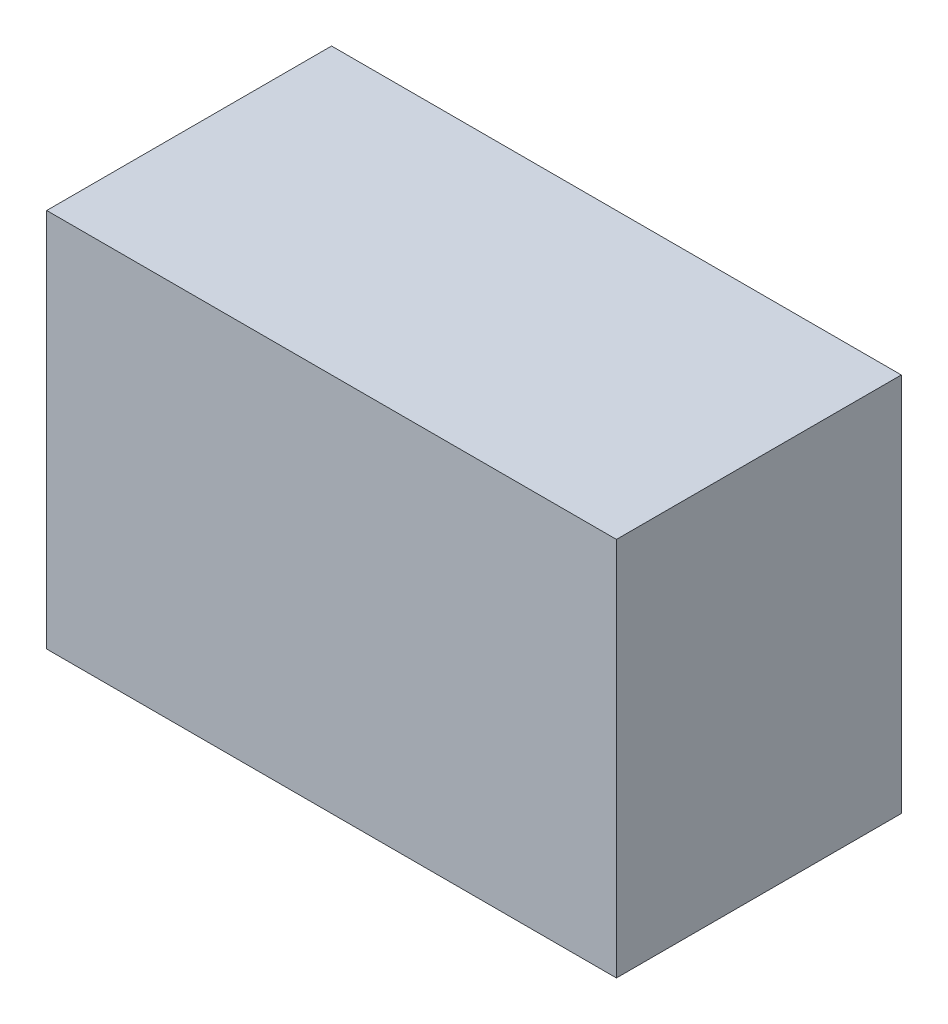
ISO-10303-21;
HEADER;
FILE_DESCRIPTION(('STEP AP214'),'2;1');
FILE_NAME('part.step','',(''),(''),'','','');
FILE_SCHEMA(('AUTOMOTIVE_DESIGN { 1 0 10303 214 1 1 1 1 }'));
ENDSEC;
DATA;
#1=APPLICATION_CONTEXT('core data for automotive mechanical design processes');
#2=APPLICATION_PROTOCOL_DEFINITION('international standard','automotive_design',2000,#1);
#3=PRODUCT_CONTEXT('',#1,'mechanical');
#4=PRODUCT('Part','Part','',(#3));
#5=PRODUCT_RELATED_PRODUCT_CATEGORY('part','',(#4));
#6=PRODUCT_DEFINITION_FORMATION('','',#4);
#7=PRODUCT_DEFINITION_CONTEXT('part definition',#1,'design');
#8=PRODUCT_DEFINITION('design','',#6,#7);
#9=PRODUCT_DEFINITION_SHAPE('','',#8);
#10=(LENGTH_UNIT() NAMED_UNIT(*) SI_UNIT(.MILLI.,.METRE.));
#11=(NAMED_UNIT(*) PLANE_ANGLE_UNIT() SI_UNIT($,.RADIAN.));
#12=(NAMED_UNIT(*) SI_UNIT($,.STERADIAN.) SOLID_ANGLE_UNIT());
#13=UNCERTAINTY_MEASURE_WITH_UNIT(LENGTH_MEASURE(1.E-05),#10,'distance_accuracy_value','');
#14=(GEOMETRIC_REPRESENTATION_CONTEXT(3) GLOBAL_UNCERTAINTY_ASSIGNED_CONTEXT((#13)) GLOBAL_UNIT_ASSIGNED_CONTEXT((#10,
#11,#12)) REPRESENTATION_CONTEXT('',''));
#15=CARTESIAN_POINT('',(0.,0.,0.));
#16=DIRECTION('',(0.,0.,1.));
#17=DIRECTION('',(1.,0.,0.));
#18=AXIS2_PLACEMENT_3D('',#15,#16,#17);
#19=CARTESIAN_POINT('',(0.,0.,6.));
#20=DIRECTION('',(0.,0.,1.));
#21=DIRECTION('',(1.,0.,0.));
#22=AXIS2_PLACEMENT_3D('',#19,#20,#21);
#23=PLANE('',#22);
#24=DIRECTION('',(-1.,0.,0.));
#25=VECTOR('',#24,1.);
#26=CARTESIAN_POINT('',(0.,-8.,6.));
#27=LINE('',#26,#25);
#28=CARTESIAN_POINT('',(12.,-8.,6.));
#29=VERTEX_POINT('',#28);
#30=CARTESIAN_POINT('',(-12.,-8.,6.));
#31=VERTEX_POINT('',#30);
#32=EDGE_CURVE('E10',#29,#31,#27,.T.);
#33=ORIENTED_EDGE('',*,*,#32,.F.);
#34=DIRECTION('',(0.,-1.,0.));
#35=VECTOR('',#34,1.);
#36=CARTESIAN_POINT('',(12.,0.,6.));
#37=LINE('',#36,#35);
#38=CARTESIAN_POINT('',(12.,8.,6.));
#39=VERTEX_POINT('',#38);
#40=EDGE_CURVE('E58',#39,#29,#37,.T.);
#41=ORIENTED_EDGE('',*,*,#40,.F.);
#42=DIRECTION('',(1.,0.,0.));
#43=VECTOR('',#42,1.);
#44=CARTESIAN_POINT('',(0.,8.,6.));
#45=LINE('',#44,#43);
#46=CARTESIAN_POINT('',(-12.,8.,6.));
#47=VERTEX_POINT('',#46);
#48=EDGE_CURVE('E88',#47,#39,#45,.T.);
#49=ORIENTED_EDGE('',*,*,#48,.F.);
#50=DIRECTION('',(0.,1.,0.));
#51=VECTOR('',#50,1.);
#52=CARTESIAN_POINT('',(-12.,0.,6.));
#53=LINE('',#52,#51);
#54=EDGE_CURVE('E23',#31,#47,#53,.T.);
#55=ORIENTED_EDGE('',*,*,#54,.F.);
#56=EDGE_LOOP('',(#33,#41,#49,#55));
#57=FACE_BOUND('',#56,.T.);
#58=ADVANCED_FACE('F16',(#57),#23,.T.);
#59=CARTESIAN_POINT('',(0.,-8.,-6.));
#60=DIRECTION('',(0.,-1.,0.));
#61=DIRECTION('',(0.,0.,-1.));
#62=AXIS2_PLACEMENT_3D('',#59,#60,#61);
#63=PLANE('',#62);
#64=DIRECTION('',(0.,0.,1.));
#65=VECTOR('',#64,1.);
#66=CARTESIAN_POINT('',(12.,-8.,-6.));
#67=LINE('',#66,#65);
#68=CARTESIAN_POINT('',(12.,-8.,-6.));
#69=VERTEX_POINT('',#68);
#70=EDGE_CURVE('E52',#69,#29,#67,.T.);
#71=ORIENTED_EDGE('',*,*,#70,.T.);
#72=ORIENTED_EDGE('',*,*,#32,.T.);
#73=DIRECTION('',(0.,0.,1.));
#74=VECTOR('',#73,1.);
#75=CARTESIAN_POINT('',(-12.,-8.,-6.));
#76=LINE('',#75,#74);
#77=CARTESIAN_POINT('',(-12.,-8.,-6.));
#78=VERTEX_POINT('',#77);
#79=EDGE_CURVE('E66',#78,#31,#76,.T.);
#80=ORIENTED_EDGE('',*,*,#79,.F.);
#81=DIRECTION('',(1.,0.,0.));
#82=VECTOR('',#81,1.);
#83=CARTESIAN_POINT('',(0.,-8.,-6.));
#84=LINE('',#83,#82);
#85=EDGE_CURVE('E63',#78,#69,#84,.T.);
#86=ORIENTED_EDGE('',*,*,#85,.T.);
#87=EDGE_LOOP('',(#71,#72,#80,#86));
#88=FACE_BOUND('',#87,.T.);
#89=ADVANCED_FACE('F65',(#88),#63,.T.);
#90=CARTESIAN_POINT('',(-12.,0.,-6.));
#91=DIRECTION('',(-1.,0.,0.));
#92=DIRECTION('',(0.,0.,1.));
#93=AXIS2_PLACEMENT_3D('',#90,#91,#92);
#94=PLANE('',#93);
#95=ORIENTED_EDGE('',*,*,#79,.T.);
#96=ORIENTED_EDGE('',*,*,#54,.T.);
#97=DIRECTION('',(0.,0.,1.));
#98=VECTOR('',#97,1.);
#99=CARTESIAN_POINT('',(-12.,8.,-6.));
#100=LINE('',#99,#98);
#101=CARTESIAN_POINT('',(-12.,8.,-6.));
#102=VERTEX_POINT('',#101);
#103=EDGE_CURVE('E81',#102,#47,#100,.T.);
#104=ORIENTED_EDGE('',*,*,#103,.F.);
#105=DIRECTION('',(0.,-1.,0.));
#106=VECTOR('',#105,1.);
#107=CARTESIAN_POINT('',(-12.,0.,-6.));
#108=LINE('',#107,#106);
#109=EDGE_CURVE('E69',#102,#78,#108,.T.);
#110=ORIENTED_EDGE('',*,*,#109,.T.);
#111=EDGE_LOOP('',(#95,#96,#104,#110));
#112=FACE_BOUND('',#111,.T.);
#113=ADVANCED_FACE('F89',(#112),#94,.T.);
#114=CARTESIAN_POINT('',(0.,8.,-6.));
#115=DIRECTION('',(0.,1.,0.));
#116=DIRECTION('',(0.,0.,1.));
#117=AXIS2_PLACEMENT_3D('',#114,#115,#116);
#118=PLANE('',#117);
#119=ORIENTED_EDGE('',*,*,#103,.T.);
#120=ORIENTED_EDGE('',*,*,#48,.T.);
#121=DIRECTION('',(0.,0.,1.));
#122=VECTOR('',#121,1.);
#123=CARTESIAN_POINT('',(12.,8.,-6.));
#124=LINE('',#123,#122);
#125=CARTESIAN_POINT('',(12.,8.,-6.));
#126=VERTEX_POINT('',#125);
#127=EDGE_CURVE('E61',#126,#39,#124,.T.);
#128=ORIENTED_EDGE('',*,*,#127,.F.);
#129=DIRECTION('',(-1.,0.,0.));
#130=VECTOR('',#129,1.);
#131=CARTESIAN_POINT('',(0.,8.,-6.));
#132=LINE('',#131,#130);
#133=EDGE_CURVE('E74',#126,#102,#132,.T.);
#134=ORIENTED_EDGE('',*,*,#133,.T.);
#135=EDGE_LOOP('',(#119,#120,#128,#134));
#136=FACE_BOUND('',#135,.T.);
#137=ADVANCED_FACE('F86',(#136),#118,.T.);
#138=CARTESIAN_POINT('',(0.,0.,-6.));
#139=DIRECTION('',(0.,0.,-1.));
#140=DIRECTION('',(-1.,0.,0.));
#141=AXIS2_PLACEMENT_3D('',#138,#139,#140);
#142=PLANE('',#141);
#143=DIRECTION('',(0.,1.,0.));
#144=VECTOR('',#143,1.);
#145=CARTESIAN_POINT('',(12.,0.,-6.));
#146=LINE('',#145,#144);
#147=EDGE_CURVE('E59',#69,#126,#146,.T.);
#148=ORIENTED_EDGE('',*,*,#147,.F.);
#149=ORIENTED_EDGE('',*,*,#85,.F.);
#150=ORIENTED_EDGE('',*,*,#109,.F.);
#151=ORIENTED_EDGE('',*,*,#133,.F.);
#152=EDGE_LOOP('',(#148,#149,#150,#151));
#153=FACE_BOUND('',#152,.T.);
#154=ADVANCED_FACE('F73',(#153),#142,.T.);
#155=CARTESIAN_POINT('',(12.,0.,-6.));
#156=DIRECTION('',(1.,0.,0.));
#157=DIRECTION('',(0.,0.,-1.));
#158=AXIS2_PLACEMENT_3D('',#155,#156,#157);
#159=PLANE('',#158);
#160=ORIENTED_EDGE('',*,*,#147,.T.);
#161=ORIENTED_EDGE('',*,*,#127,.T.);
#162=ORIENTED_EDGE('',*,*,#40,.T.);
#163=ORIENTED_EDGE('',*,*,#70,.F.);
#164=EDGE_LOOP('',(#160,#161,#162,#163));
#165=FACE_BOUND('',#164,.T.);
#166=ADVANCED_FACE('F54',(#165),#159,.T.);
#167=CLOSED_SHELL('',(#58,#89,#113,#137,#154,#166));
#168=MANIFOLD_SOLID_BREP('B1',#167);
#169=ADVANCED_BREP_SHAPE_REPRESENTATION('',(#18,#168),#14);
#170=SHAPE_DEFINITION_REPRESENTATION(#9,#169);
ENDSEC;
END-ISO-10303-21;
